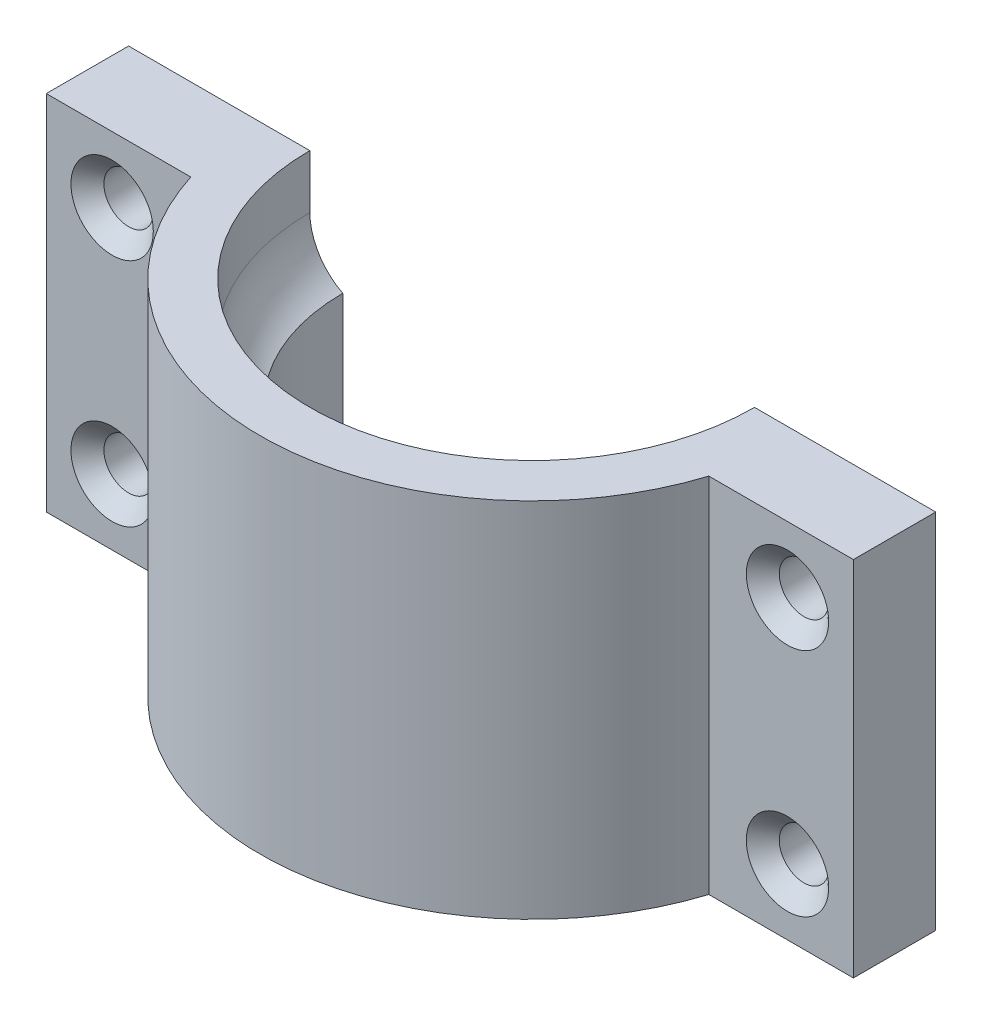
ISO-10303-21;
HEADER;
FILE_DESCRIPTION(('STEP AP214'),'2;1');
FILE_NAME('part.step','',(''),(''),'','','');
FILE_SCHEMA(('AUTOMOTIVE_DESIGN { 1 0 10303 214 1 1 1 1 }'));
ENDSEC;
DATA;
#1=APPLICATION_CONTEXT('core data for automotive mechanical design processes');
#2=APPLICATION_PROTOCOL_DEFINITION('international standard','automotive_design',2000,#1);
#3=PRODUCT_CONTEXT('',#1,'mechanical');
#4=PRODUCT('Part','Part','',(#3));
#5=PRODUCT_RELATED_PRODUCT_CATEGORY('part','',(#4));
#6=PRODUCT_DEFINITION_FORMATION('','',#4);
#7=PRODUCT_DEFINITION_CONTEXT('part definition',#1,'design');
#8=PRODUCT_DEFINITION('design','',#6,#7);
#9=PRODUCT_DEFINITION_SHAPE('','',#8);
#10=(LENGTH_UNIT() NAMED_UNIT(*) SI_UNIT(.MILLI.,.METRE.));
#11=(NAMED_UNIT(*) PLANE_ANGLE_UNIT() SI_UNIT($,.RADIAN.));
#12=(NAMED_UNIT(*) SI_UNIT($,.STERADIAN.) SOLID_ANGLE_UNIT());
#13=UNCERTAINTY_MEASURE_WITH_UNIT(LENGTH_MEASURE(1.E-05),#10,'distance_accuracy_value','');
#14=(GEOMETRIC_REPRESENTATION_CONTEXT(3) GLOBAL_UNCERTAINTY_ASSIGNED_CONTEXT((#13)) GLOBAL_UNIT_ASSIGNED_CONTEXT((#10,
#11,#12)) REPRESENTATION_CONTEXT('',''));
#15=CARTESIAN_POINT('',(0.,0.,0.));
#16=DIRECTION('',(0.,0.,1.));
#17=DIRECTION('',(1.,0.,0.));
#18=AXIS2_PLACEMENT_3D('',#15,#16,#17);
#19=CARTESIAN_POINT('',(0.,-22.,0.));
#20=DIRECTION('',(0.,0.,-1.));
#21=DIRECTION('',(-1.,0.,0.));
#22=AXIS2_PLACEMENT_3D('',#19,#20,#21);
#23=PLANE('',#22);
#24=CARTESIAN_POINT('',(-20.5,-18.,0.));
#25=DIRECTION('',(0.,0.,-1.));
#26=DIRECTION('',(-1.,0.,0.));
#27=AXIS2_PLACEMENT_3D('',#24,#25,#26);
#28=CIRCLE('',#27,1.5);
#29=CARTESIAN_POINT('',(-22.,-18.,0.));
#30=VERTEX_POINT('',#29);
#31=EDGE_CURVE('E165',#30,#30,#28,.T.);
#32=ORIENTED_EDGE('',*,*,#31,.F.);
#33=EDGE_LOOP('',(#32));
#34=FACE_BOUND('',#33,.T.);
#35=CARTESIAN_POINT('',(-20.5,-4.,0.));
#36=DIRECTION('',(0.,0.,-1.));
#37=DIRECTION('',(-1.,0.,0.));
#38=AXIS2_PLACEMENT_3D('',#35,#36,#37);
#39=CIRCLE('',#38,1.5);
#40=CARTESIAN_POINT('',(-22.,-4.,0.));
#41=VERTEX_POINT('',#40);
#42=EDGE_CURVE('E206',#41,#41,#39,.T.);
#43=ORIENTED_EDGE('',*,*,#42,.F.);
#44=EDGE_LOOP('',(#43));
#45=FACE_BOUND('',#44,.T.);
#46=DIRECTION('',(0.,1.,0.));
#47=VECTOR('',#46,1.);
#48=CARTESIAN_POINT('',(-13.5,2.83425520472351,0.));
#49=LINE('',#48,#47);
#50=CARTESIAN_POINT('',(-13.5,0.,0.));
#51=VERTEX_POINT('',#50);
#52=CARTESIAN_POINT('',(-13.5,-3.26371538085914,0.));
#53=VERTEX_POINT('',#52);
#54=EDGE_CURVE('E65',#51,#53,#49,.F.);
#55=ORIENTED_EDGE('',*,*,#54,.T.);
#56=CARTESIAN_POINT('',(-9.8003409289421,-3.21348831704943,0.));
#57=DIRECTION('',(0.,0.,-1.));
#58=DIRECTION('',(-1.,0.,0.));
#59=AXIS2_PLACEMENT_3D('',#56,#57,#58);
#60=CIRCLE('',#59,3.7);
#61=CARTESIAN_POINT('',(-11.5,-6.5,0.));
#62=VERTEX_POINT('',#61);
#63=EDGE_CURVE('E254',#53,#62,#60,.F.);
#64=ORIENTED_EDGE('',*,*,#63,.T.);
#65=DIRECTION('',(0.,1.,0.));
#66=VECTOR('',#65,1.);
#67=CARTESIAN_POINT('',(-11.5,-22.,0.));
#68=LINE('',#67,#66);
#69=CARTESIAN_POINT('',(-11.5,-22.,0.));
#70=VERTEX_POINT('',#69);
#71=EDGE_CURVE('E138',#70,#62,#68,.T.);
#72=ORIENTED_EDGE('',*,*,#71,.F.);
#73=DIRECTION('',(-1.,0.,0.));
#74=VECTOR('',#73,1.);
#75=CARTESIAN_POINT('',(0.,-22.,0.));
#76=LINE('',#75,#74);
#77=CARTESIAN_POINT('',(-24.5,-22.,0.));
#78=VERTEX_POINT('',#77);
#79=EDGE_CURVE('E142',#70,#78,#76,.T.);
#80=ORIENTED_EDGE('',*,*,#79,.T.);
#81=DIRECTION('',(0.,1.,0.));
#82=VECTOR('',#81,1.);
#83=CARTESIAN_POINT('',(-24.5,-22.,0.));
#84=LINE('',#83,#82);
#85=CARTESIAN_POINT('',(-24.5,0.,0.));
#86=VERTEX_POINT('',#85);
#87=EDGE_CURVE('E126',#78,#86,#84,.T.);
#88=ORIENTED_EDGE('',*,*,#87,.T.);
#89=DIRECTION('',(-1.,0.,0.));
#90=VECTOR('',#89,1.);
#91=CARTESIAN_POINT('',(0.,0.,0.));
#92=LINE('',#91,#90);
#93=EDGE_CURVE('E175',#51,#86,#92,.T.);
#94=ORIENTED_EDGE('',*,*,#93,.F.);
#95=EDGE_LOOP('',(#55,#64,#72,#80,#88,#94));
#96=FACE_BOUND('',#95,.T.);
#97=ADVANCED_FACE('F48',(#34,#45,#96),#23,.T.);
#98=CARTESIAN_POINT('',(0.,-22.,0.));
#99=DIRECTION('',(0.,1.,0.));
#100=DIRECTION('',(0.,0.,1.));
#101=AXIS2_PLACEMENT_3D('',#98,#99,#100);
#102=CYLINDRICAL_SURFACE('',#101,11.5);
#103=CARTESIAN_POINT('',(0.,-6.5,0.));
#104=DIRECTION('',(0.,1.,0.));
#105=DIRECTION('',(0.,0.,1.));
#106=AXIS2_PLACEMENT_3D('',#103,#104,#105);
#107=CIRCLE('',#106,11.5);
#108=CARTESIAN_POINT('',(11.5,-6.5,0.));
#109=VERTEX_POINT('',#108);
#110=EDGE_CURVE('E265',#62,#109,#107,.T.);
#111=ORIENTED_EDGE('',*,*,#110,.T.);
#112=DIRECTION('',(0.,1.,0.));
#113=VECTOR('',#112,1.);
#114=CARTESIAN_POINT('',(11.5,-22.,0.));
#115=LINE('',#114,#113);
#116=CARTESIAN_POINT('',(11.5,-22.,0.));
#117=VERTEX_POINT('',#116);
#118=EDGE_CURVE('E192',#117,#109,#115,.T.);
#119=ORIENTED_EDGE('',*,*,#118,.F.);
#120=CARTESIAN_POINT('',(0.,-22.,0.));
#121=DIRECTION('',(0.,1.,0.));
#122=DIRECTION('',(0.,0.,1.));
#123=AXIS2_PLACEMENT_3D('',#120,#121,#122);
#124=CIRCLE('',#123,11.5);
#125=EDGE_CURVE('E150',#70,#117,#124,.T.);
#126=ORIENTED_EDGE('',*,*,#125,.F.);
#127=ORIENTED_EDGE('',*,*,#71,.T.);
#128=EDGE_LOOP('',(#111,#119,#126,#127));
#129=FACE_BOUND('',#128,.T.);
#130=ADVANCED_FACE('F309',(#129),#102,.F.);
#131=CARTESIAN_POINT('',(0.,-22.,0.));
#132=DIRECTION('',(0.,0.,1.));
#133=DIRECTION('',(1.,0.,0.));
#134=AXIS2_PLACEMENT_3D('',#131,#132,#133);
#135=PLANE('',#134);
#136=CARTESIAN_POINT('',(20.5,-18.,0.));
#137=DIRECTION('',(0.,0.,1.));
#138=DIRECTION('',(1.,0.,0.));
#139=AXIS2_PLACEMENT_3D('',#136,#137,#138);
#140=CIRCLE('',#139,1.5);
#141=CARTESIAN_POINT('',(22.,-18.,0.));
#142=VERTEX_POINT('',#141);
#143=EDGE_CURVE('E263',#142,#142,#140,.T.);
#144=ORIENTED_EDGE('',*,*,#143,.T.);
#145=EDGE_LOOP('',(#144));
#146=FACE_BOUND('',#145,.T.);
#147=CARTESIAN_POINT('',(20.5,-4.,0.));
#148=DIRECTION('',(0.,0.,1.));
#149=DIRECTION('',(1.,0.,0.));
#150=AXIS2_PLACEMENT_3D('',#147,#148,#149);
#151=CIRCLE('',#150,1.5);
#152=CARTESIAN_POINT('',(22.,-4.,0.));
#153=VERTEX_POINT('',#152);
#154=EDGE_CURVE('E210',#153,#153,#151,.T.);
#155=ORIENTED_EDGE('',*,*,#154,.T.);
#156=EDGE_LOOP('',(#155));
#157=FACE_BOUND('',#156,.T.);
#158=CARTESIAN_POINT('',(9.8003409289421,-3.21348831704943,0.));
#159=DIRECTION('',(0.,0.,1.));
#160=DIRECTION('',(1.,0.,0.));
#161=AXIS2_PLACEMENT_3D('',#158,#159,#160);
#162=CIRCLE('',#161,3.7);
#163=CARTESIAN_POINT('',(13.5,-3.26371538085914,0.));
#164=VERTEX_POINT('',#163);
#165=EDGE_CURVE('E11',#164,#109,#162,.F.);
#166=ORIENTED_EDGE('',*,*,#165,.F.);
#167=DIRECTION('',(0.,1.,0.));
#168=VECTOR('',#167,1.);
#169=CARTESIAN_POINT('',(13.5,2.83425520472351,0.));
#170=LINE('',#169,#168);
#171=CARTESIAN_POINT('',(13.5,0.,0.));
#172=VERTEX_POINT('',#171);
#173=EDGE_CURVE('E259',#172,#164,#170,.F.);
#174=ORIENTED_EDGE('',*,*,#173,.F.);
#175=DIRECTION('',(1.,0.,0.));
#176=VECTOR('',#175,1.);
#177=CARTESIAN_POINT('',(0.,0.,0.));
#178=LINE('',#177,#176);
#179=CARTESIAN_POINT('',(24.5,0.,0.));
#180=VERTEX_POINT('',#179);
#181=EDGE_CURVE('E172',#172,#180,#178,.T.);
#182=ORIENTED_EDGE('',*,*,#181,.T.);
#183=DIRECTION('',(0.,1.,0.));
#184=VECTOR('',#183,1.);
#185=CARTESIAN_POINT('',(24.5,-22.,0.));
#186=LINE('',#185,#184);
#187=CARTESIAN_POINT('',(24.5,-22.,0.));
#188=VERTEX_POINT('',#187);
#189=EDGE_CURVE('E196',#188,#180,#186,.T.);
#190=ORIENTED_EDGE('',*,*,#189,.F.);
#191=DIRECTION('',(1.,0.,0.));
#192=VECTOR('',#191,1.);
#193=CARTESIAN_POINT('',(0.,-22.,0.));
#194=LINE('',#193,#192);
#195=EDGE_CURVE('E153',#117,#188,#194,.T.);
#196=ORIENTED_EDGE('',*,*,#195,.F.);
#197=ORIENTED_EDGE('',*,*,#118,.T.);
#198=EDGE_LOOP('',(#166,#174,#182,#190,#196,#197));
#199=FACE_BOUND('',#198,.T.);
#200=ADVANCED_FACE('F289',(#146,#157,#199),#135,.F.);
#201=CARTESIAN_POINT('',(0.,-22.,0.));
#202=DIRECTION('',(0.,1.,0.));
#203=DIRECTION('',(0.,0.,1.));
#204=AXIS2_PLACEMENT_3D('',#201,#202,#203);
#205=CYLINDRICAL_SURFACE('',#204,16.5);
#206=CARTESIAN_POINT('',(0.,0.,0.));
#207=DIRECTION('',(0.,1.,0.));
#208=DIRECTION('',(0.,0.,1.));
#209=AXIS2_PLACEMENT_3D('',#206,#207,#208);
#210=CIRCLE('',#209,16.5);
#211=CARTESIAN_POINT('',(-15.7241851935164,0.,5.));
#212=VERTEX_POINT('',#211);
#213=CARTESIAN_POINT('',(15.7241851935164,0.,5.));
#214=VERTEX_POINT('',#213);
#215=EDGE_CURVE('E160',#212,#214,#210,.T.);
#216=ORIENTED_EDGE('',*,*,#215,.F.);
#217=DIRECTION('',(0.,1.,0.));
#218=VECTOR('',#217,1.);
#219=CARTESIAN_POINT('',(-15.7241851935164,-22.,5.));
#220=LINE('',#219,#218);
#221=CARTESIAN_POINT('',(-15.7241851935164,-22.,5.));
#222=VERTEX_POINT('',#221);
#223=EDGE_CURVE('E74',#222,#212,#220,.T.);
#224=ORIENTED_EDGE('',*,*,#223,.F.);
#225=CARTESIAN_POINT('',(0.,-22.,0.));
#226=DIRECTION('',(0.,1.,0.));
#227=DIRECTION('',(0.,0.,1.));
#228=AXIS2_PLACEMENT_3D('',#225,#226,#227);
#229=CIRCLE('',#228,16.5);
#230=CARTESIAN_POINT('',(15.7241851935164,-22.,5.));
#231=VERTEX_POINT('',#230);
#232=EDGE_CURVE('E184',#222,#231,#229,.T.);
#233=ORIENTED_EDGE('',*,*,#232,.T.);
#234=DIRECTION('',(0.,1.,0.));
#235=VECTOR('',#234,1.);
#236=CARTESIAN_POINT('',(15.7241851935164,-22.,5.));
#237=LINE('',#236,#235);
#238=EDGE_CURVE('E159',#231,#214,#237,.T.);
#239=ORIENTED_EDGE('',*,*,#238,.T.);
#240=EDGE_LOOP('',(#216,#224,#233,#239));
#241=FACE_BOUND('',#240,.T.);
#242=ADVANCED_FACE('F295',(#241),#205,.T.);
#243=CARTESIAN_POINT('',(0.,-22.,5.));
#244=DIRECTION('',(0.,0.,1.));
#245=DIRECTION('',(1.,0.,0.));
#246=AXIS2_PLACEMENT_3D('',#243,#244,#245);
#247=PLANE('',#246);
#248=CARTESIAN_POINT('',(-20.5,-4.,5.));
#249=DIRECTION('',(0.,0.,1.));
#250=DIRECTION('',(1.,0.,0.));
#251=AXIS2_PLACEMENT_3D('',#248,#249,#250);
#252=CIRCLE('',#251,2.5);
#253=CARTESIAN_POINT('',(-18.,-4.,5.));
#254=VERTEX_POINT('',#253);
#255=EDGE_CURVE('E237',#254,#254,#252,.F.);
#256=ORIENTED_EDGE('',*,*,#255,.T.);
#257=EDGE_LOOP('',(#256));
#258=FACE_BOUND('',#257,.T.);
#259=CARTESIAN_POINT('',(-20.5,-18.,5.));
#260=DIRECTION('',(0.,0.,1.));
#261=DIRECTION('',(1.,0.,0.));
#262=AXIS2_PLACEMENT_3D('',#259,#260,#261);
#263=CIRCLE('',#262,2.50000000000002);
#264=CARTESIAN_POINT('',(-18.,-18.,5.));
#265=VERTEX_POINT('',#264);
#266=EDGE_CURVE('E233',#265,#265,#263,.F.);
#267=ORIENTED_EDGE('',*,*,#266,.T.);
#268=EDGE_LOOP('',(#267));
#269=FACE_BOUND('',#268,.T.);
#270=DIRECTION('',(1.,0.,0.));
#271=VECTOR('',#270,1.);
#272=CARTESIAN_POINT('',(0.,0.,5.));
#273=LINE('',#272,#271);
#274=CARTESIAN_POINT('',(-24.5,0.,5.));
#275=VERTEX_POINT('',#274);
#276=EDGE_CURVE('E180',#275,#212,#273,.T.);
#277=ORIENTED_EDGE('',*,*,#276,.F.);
#278=DIRECTION('',(0.,1.,0.));
#279=VECTOR('',#278,1.);
#280=CARTESIAN_POINT('',(-24.5,-22.,5.));
#281=LINE('',#280,#279);
#282=CARTESIAN_POINT('',(-24.5,-22.,5.));
#283=VERTEX_POINT('',#282);
#284=EDGE_CURVE('E137',#283,#275,#281,.T.);
#285=ORIENTED_EDGE('',*,*,#284,.F.);
#286=DIRECTION('',(1.,0.,0.));
#287=VECTOR('',#286,1.);
#288=CARTESIAN_POINT('',(0.,-22.,5.));
#289=LINE('',#288,#287);
#290=EDGE_CURVE('E143',#283,#222,#289,.T.);
#291=ORIENTED_EDGE('',*,*,#290,.T.);
#292=ORIENTED_EDGE('',*,*,#223,.T.);
#293=EDGE_LOOP('',(#277,#285,#291,#292));
#294=FACE_BOUND('',#293,.T.);
#295=ADVANCED_FACE('F296',(#258,#269,#294),#247,.T.);
#296=CARTESIAN_POINT('',(-24.5,-22.,0.));
#297=DIRECTION('',(-1.,0.,0.));
#298=DIRECTION('',(0.,0.,1.));
#299=AXIS2_PLACEMENT_3D('',#296,#297,#298);
#300=PLANE('',#299);
#301=DIRECTION('',(0.,0.,1.));
#302=VECTOR('',#301,1.);
#303=CARTESIAN_POINT('',(-24.5,0.,0.));
#304=LINE('',#303,#302);
#305=EDGE_CURVE('E132',#86,#275,#304,.T.);
#306=ORIENTED_EDGE('',*,*,#305,.F.);
#307=ORIENTED_EDGE('',*,*,#87,.F.);
#308=DIRECTION('',(0.,0.,1.));
#309=VECTOR('',#308,1.);
#310=CARTESIAN_POINT('',(-24.5,-22.,0.));
#311=LINE('',#310,#309);
#312=EDGE_CURVE('E129',#78,#283,#311,.T.);
#313=ORIENTED_EDGE('',*,*,#312,.T.);
#314=ORIENTED_EDGE('',*,*,#284,.T.);
#315=EDGE_LOOP('',(#306,#307,#313,#314));
#316=FACE_BOUND('',#315,.T.);
#317=ADVANCED_FACE('F128',(#316),#300,.T.);
#318=CARTESIAN_POINT('',(24.5,-22.,0.));
#319=DIRECTION('',(-1.,0.,0.));
#320=DIRECTION('',(0.,0.,1.));
#321=AXIS2_PLACEMENT_3D('',#318,#319,#320);
#322=PLANE('',#321);
#323=DIRECTION('',(0.,0.,1.));
#324=VECTOR('',#323,1.);
#325=CARTESIAN_POINT('',(24.5,0.,0.));
#326=LINE('',#325,#324);
#327=CARTESIAN_POINT('',(24.5,0.,5.));
#328=VERTEX_POINT('',#327);
#329=EDGE_CURVE('E169',#180,#328,#326,.T.);
#330=ORIENTED_EDGE('',*,*,#329,.T.);
#331=DIRECTION('',(0.,1.,0.));
#332=VECTOR('',#331,1.);
#333=CARTESIAN_POINT('',(24.5,-22.,5.));
#334=LINE('',#333,#332);
#335=CARTESIAN_POINT('',(24.5,-22.,5.));
#336=VERTEX_POINT('',#335);
#337=EDGE_CURVE('E200',#336,#328,#334,.T.);
#338=ORIENTED_EDGE('',*,*,#337,.F.);
#339=DIRECTION('',(0.,0.,1.));
#340=VECTOR('',#339,1.);
#341=CARTESIAN_POINT('',(24.5,-22.,0.));
#342=LINE('',#341,#340);
#343=EDGE_CURVE('E279',#188,#336,#342,.T.);
#344=ORIENTED_EDGE('',*,*,#343,.F.);
#345=ORIENTED_EDGE('',*,*,#189,.T.);
#346=EDGE_LOOP('',(#330,#338,#344,#345));
#347=FACE_BOUND('',#346,.T.);
#348=ADVANCED_FACE('F291',(#347),#322,.F.);
#349=CARTESIAN_POINT('',(0.,-22.,5.));
#350=DIRECTION('',(0.,0.,-1.));
#351=DIRECTION('',(-1.,0.,0.));
#352=AXIS2_PLACEMENT_3D('',#349,#350,#351);
#353=PLANE('',#352);
#354=CARTESIAN_POINT('',(20.5,-4.,5.));
#355=DIRECTION('',(0.,0.,-1.));
#356=DIRECTION('',(-1.,0.,0.));
#357=AXIS2_PLACEMENT_3D('',#354,#355,#356);
#358=CIRCLE('',#357,2.5);
#359=CARTESIAN_POINT('',(18.,-4.,5.));
#360=VERTEX_POINT('',#359);
#361=EDGE_CURVE('E221',#360,#360,#358,.T.);
#362=ORIENTED_EDGE('',*,*,#361,.T.);
#363=EDGE_LOOP('',(#362));
#364=FACE_BOUND('',#363,.T.);
#365=CARTESIAN_POINT('',(20.5,-18.,5.));
#366=DIRECTION('',(0.,0.,-1.));
#367=DIRECTION('',(-1.,0.,0.));
#368=AXIS2_PLACEMENT_3D('',#365,#366,#367);
#369=CIRCLE('',#368,2.50000000000002);
#370=CARTESIAN_POINT('',(18.,-18.,5.));
#371=VERTEX_POINT('',#370);
#372=EDGE_CURVE('E217',#371,#371,#369,.T.);
#373=ORIENTED_EDGE('',*,*,#372,.T.);
#374=EDGE_LOOP('',(#373));
#375=FACE_BOUND('',#374,.T.);
#376=DIRECTION('',(-1.,0.,0.));
#377=VECTOR('',#376,1.);
#378=CARTESIAN_POINT('',(0.,0.,5.));
#379=LINE('',#378,#377);
#380=EDGE_CURVE('E164',#328,#214,#379,.T.);
#381=ORIENTED_EDGE('',*,*,#380,.T.);
#382=ORIENTED_EDGE('',*,*,#238,.F.);
#383=DIRECTION('',(-1.,0.,0.));
#384=VECTOR('',#383,1.);
#385=CARTESIAN_POINT('',(0.,-22.,5.));
#386=LINE('',#385,#384);
#387=EDGE_CURVE('E107',#336,#231,#386,.T.);
#388=ORIENTED_EDGE('',*,*,#387,.F.);
#389=ORIENTED_EDGE('',*,*,#337,.T.);
#390=EDGE_LOOP('',(#381,#382,#388,#389));
#391=FACE_BOUND('',#390,.T.);
#392=ADVANCED_FACE('F294',(#364,#375,#391),#353,.F.);
#393=CARTESIAN_POINT('',(0.,-22.,0.));
#394=DIRECTION('',(0.,1.,0.));
#395=DIRECTION('',(0.,0.,1.));
#396=AXIS2_PLACEMENT_3D('',#393,#394,#395);
#397=PLANE('',#396);
#398=ORIENTED_EDGE('',*,*,#232,.F.);
#399=ORIENTED_EDGE('',*,*,#290,.F.);
#400=ORIENTED_EDGE('',*,*,#312,.F.);
#401=ORIENTED_EDGE('',*,*,#79,.F.);
#402=ORIENTED_EDGE('',*,*,#125,.T.);
#403=ORIENTED_EDGE('',*,*,#195,.T.);
#404=ORIENTED_EDGE('',*,*,#343,.T.);
#405=ORIENTED_EDGE('',*,*,#387,.T.);
#406=EDGE_LOOP('',(#398,#399,#400,#401,#402,#403,#404,#405));
#407=FACE_BOUND('',#406,.T.);
#408=ADVANCED_FACE('F141',(#407),#397,.F.);
#409=CARTESIAN_POINT('',(0.,0.,0.));
#410=DIRECTION('',(0.,1.,0.));
#411=DIRECTION('',(0.,0.,1.));
#412=AXIS2_PLACEMENT_3D('',#409,#410,#411);
#413=PLANE('',#412);
#414=ORIENTED_EDGE('',*,*,#181,.F.);
#415=CARTESIAN_POINT('',(0.,0.,0.));
#416=DIRECTION('',(0.,1.,0.));
#417=DIRECTION('',(0.,0.,1.));
#418=AXIS2_PLACEMENT_3D('',#415,#416,#417);
#419=CIRCLE('',#418,13.5);
#420=EDGE_CURVE('E58',#172,#51,#419,.F.);
#421=ORIENTED_EDGE('',*,*,#420,.T.);
#422=ORIENTED_EDGE('',*,*,#93,.T.);
#423=ORIENTED_EDGE('',*,*,#305,.T.);
#424=ORIENTED_EDGE('',*,*,#276,.T.);
#425=ORIENTED_EDGE('',*,*,#215,.T.);
#426=ORIENTED_EDGE('',*,*,#380,.F.);
#427=ORIENTED_EDGE('',*,*,#329,.F.);
#428=EDGE_LOOP('',(#414,#421,#422,#423,#424,#425,#426,#427));
#429=FACE_BOUND('',#428,.T.);
#430=ADVANCED_FACE('F247',(#429),#413,.T.);
#431=CARTESIAN_POINT('',(20.5,-18.,-6.6746653814699));
#432=DIRECTION('',(0.,0.,1.));
#433=DIRECTION('',(1.,0.,0.));
#434=AXIS2_PLACEMENT_3D('',#431,#432,#433);
#435=CYLINDRICAL_SURFACE('',#434,1.5);
#436=CARTESIAN_POINT('',(20.5,-18.,3.99999999999999));
#437=DIRECTION('',(0.,0.,-1.));
#438=DIRECTION('',(-1.,0.,0.));
#439=AXIS2_PLACEMENT_3D('',#436,#437,#438);
#440=CIRCLE('',#439,1.5);
#441=CARTESIAN_POINT('',(19.,-18.,3.99999999999999));
#442=VERTEX_POINT('',#441);
#443=EDGE_CURVE('E225',#442,#442,#440,.F.);
#444=ORIENTED_EDGE('',*,*,#443,.T.);
#445=EDGE_LOOP('',(#444));
#446=FACE_BOUND('',#445,.T.);
#447=ORIENTED_EDGE('',*,*,#143,.F.);
#448=EDGE_LOOP('',(#447));
#449=FACE_BOUND('',#448,.T.);
#450=ADVANCED_FACE('F369',(#446,#449),#435,.F.);
#451=CARTESIAN_POINT('',(20.5,-4.,-6.6746653814699));
#452=DIRECTION('',(0.,0.,1.));
#453=DIRECTION('',(1.,0.,0.));
#454=AXIS2_PLACEMENT_3D('',#451,#452,#453);
#455=CYLINDRICAL_SURFACE('',#454,1.5);
#456=CARTESIAN_POINT('',(20.5,-4.,4.00000000000001));
#457=DIRECTION('',(0.,0.,-1.));
#458=DIRECTION('',(-1.,0.,0.));
#459=AXIS2_PLACEMENT_3D('',#456,#457,#458);
#460=CIRCLE('',#459,1.5);
#461=CARTESIAN_POINT('',(19.,-4.,4.00000000000001));
#462=VERTEX_POINT('',#461);
#463=EDGE_CURVE('E187',#462,#462,#460,.F.);
#464=ORIENTED_EDGE('',*,*,#463,.T.);
#465=EDGE_LOOP('',(#464));
#466=FACE_BOUND('',#465,.T.);
#467=ORIENTED_EDGE('',*,*,#154,.F.);
#468=EDGE_LOOP('',(#467));
#469=FACE_BOUND('',#468,.T.);
#470=ADVANCED_FACE('F360',(#466,#469),#455,.F.);
#471=CARTESIAN_POINT('',(-20.5,-4.,-6.6746653814699));
#472=DIRECTION('',(0.,0.,1.));
#473=DIRECTION('',(1.,0.,0.));
#474=AXIS2_PLACEMENT_3D('',#471,#472,#473);
#475=CYLINDRICAL_SURFACE('',#474,1.5);
#476=CARTESIAN_POINT('',(-20.5,-4.,4.00000000000001));
#477=DIRECTION('',(0.,0.,1.));
#478=DIRECTION('',(1.,0.,0.));
#479=AXIS2_PLACEMENT_3D('',#476,#477,#478);
#480=CIRCLE('',#479,1.5);
#481=CARTESIAN_POINT('',(-19.,-4.,4.00000000000001));
#482=VERTEX_POINT('',#481);
#483=EDGE_CURVE('E229',#482,#482,#480,.T.);
#484=ORIENTED_EDGE('',*,*,#483,.T.);
#485=EDGE_LOOP('',(#484));
#486=FACE_BOUND('',#485,.T.);
#487=ORIENTED_EDGE('',*,*,#42,.T.);
#488=EDGE_LOOP('',(#487));
#489=FACE_BOUND('',#488,.T.);
#490=ADVANCED_FACE('F357',(#486,#489),#475,.F.);
#491=CARTESIAN_POINT('',(-20.5,-18.,-6.6746653814699));
#492=DIRECTION('',(0.,0.,1.));
#493=DIRECTION('',(1.,0.,0.));
#494=AXIS2_PLACEMENT_3D('',#491,#492,#493);
#495=CYLINDRICAL_SURFACE('',#494,1.5);
#496=CARTESIAN_POINT('',(-20.5,-18.,3.99999999999999));
#497=DIRECTION('',(0.,0.,1.));
#498=DIRECTION('',(1.,0.,0.));
#499=AXIS2_PLACEMENT_3D('',#496,#497,#498);
#500=CIRCLE('',#499,1.5);
#501=CARTESIAN_POINT('',(-19.,-18.,3.99999999999999));
#502=VERTEX_POINT('',#501);
#503=EDGE_CURVE('E241',#502,#502,#500,.T.);
#504=ORIENTED_EDGE('',*,*,#503,.T.);
#505=EDGE_LOOP('',(#504));
#506=FACE_BOUND('',#505,.T.);
#507=ORIENTED_EDGE('',*,*,#31,.T.);
#508=EDGE_LOOP('',(#507));
#509=FACE_BOUND('',#508,.T.);
#510=ADVANCED_FACE('F336',(#506,#509),#495,.F.);
#511=CARTESIAN_POINT('',(20.5,-4.,4.00000000000001));
#512=DIRECTION('',(0.,0.,1.));
#513=DIRECTION('',(1.,0.,0.));
#514=AXIS2_PLACEMENT_3D('',#511,#512,#513);
#515=CONICAL_SURFACE('',#514,1.5,0.785398163397449);
#516=ORIENTED_EDGE('',*,*,#361,.F.);
#517=EDGE_LOOP('',(#516));
#518=FACE_BOUND('',#517,.T.);
#519=ORIENTED_EDGE('',*,*,#463,.F.);
#520=EDGE_LOOP('',(#519));
#521=FACE_BOUND('',#520,.T.);
#522=ADVANCED_FACE('F329',(#518,#521),#515,.F.);
#523=CARTESIAN_POINT('',(20.5,-18.,3.99999999999999));
#524=DIRECTION('',(0.,0.,1.));
#525=DIRECTION('',(1.,0.,0.));
#526=AXIS2_PLACEMENT_3D('',#523,#524,#525);
#527=CONICAL_SURFACE('',#526,1.5,0.785398163397449);
#528=ORIENTED_EDGE('',*,*,#372,.F.);
#529=EDGE_LOOP('',(#528));
#530=FACE_BOUND('',#529,.T.);
#531=ORIENTED_EDGE('',*,*,#443,.F.);
#532=EDGE_LOOP('',(#531));
#533=FACE_BOUND('',#532,.T.);
#534=ADVANCED_FACE('F335',(#530,#533),#527,.F.);
#535=CARTESIAN_POINT('',(-20.5,-4.,4.00000000000001));
#536=DIRECTION('',(0.,0.,1.));
#537=DIRECTION('',(1.,0.,0.));
#538=AXIS2_PLACEMENT_3D('',#535,#536,#537);
#539=CONICAL_SURFACE('',#538,1.5,0.785398163397449);
#540=ORIENTED_EDGE('',*,*,#255,.F.);
#541=EDGE_LOOP('',(#540));
#542=FACE_BOUND('',#541,.T.);
#543=ORIENTED_EDGE('',*,*,#483,.F.);
#544=EDGE_LOOP('',(#543));
#545=FACE_BOUND('',#544,.T.);
#546=ADVANCED_FACE('F342',(#542,#545),#539,.F.);
#547=CARTESIAN_POINT('',(-20.5,-18.,3.99999999999999));
#548=DIRECTION('',(0.,0.,1.));
#549=DIRECTION('',(1.,0.,0.));
#550=AXIS2_PLACEMENT_3D('',#547,#548,#549);
#551=CONICAL_SURFACE('',#550,1.5,0.785398163397449);
#552=ORIENTED_EDGE('',*,*,#266,.F.);
#553=EDGE_LOOP('',(#552));
#554=FACE_BOUND('',#553,.T.);
#555=ORIENTED_EDGE('',*,*,#503,.F.);
#556=EDGE_LOOP('',(#555));
#557=FACE_BOUND('',#556,.T.);
#558=ADVANCED_FACE('F51',(#554,#557),#551,.F.);
#559=CARTESIAN_POINT('',(0.,-3.21348831704943,0.));
#560=DIRECTION('',(0.,1.,0.));
#561=DIRECTION('',(0.,0.,1.));
#562=AXIS2_PLACEMENT_3D('',#559,#560,#561);
#563=TOROIDAL_SURFACE('',#562,9.8003409289421,3.7);
#564=CARTESIAN_POINT('',(0.,-3.26371538085914,0.));
#565=DIRECTION('',(0.,1.,0.));
#566=DIRECTION('',(0.,0.,1.));
#567=AXIS2_PLACEMENT_3D('',#564,#565,#566);
#568=CIRCLE('',#567,13.5);
#569=EDGE_CURVE('E550',#53,#164,#568,.T.);
#570=ORIENTED_EDGE('',*,*,#569,.T.);
#571=ORIENTED_EDGE('',*,*,#165,.T.);
#572=ORIENTED_EDGE('',*,*,#110,.F.);
#573=ORIENTED_EDGE('',*,*,#63,.F.);
#574=EDGE_LOOP('',(#570,#571,#572,#573));
#575=FACE_BOUND('',#574,.T.);
#576=ADVANCED_FACE('F351',(#575),#563,.F.);
#577=CARTESIAN_POINT('',(0.,2.83425520472351,0.));
#578=DIRECTION('',(0.,1.,0.));
#579=DIRECTION('',(0.,0.,1.));
#580=AXIS2_PLACEMENT_3D('',#577,#578,#579);
#581=CYLINDRICAL_SURFACE('',#580,13.5);
#582=ORIENTED_EDGE('',*,*,#420,.F.);
#583=ORIENTED_EDGE('',*,*,#173,.T.);
#584=ORIENTED_EDGE('',*,*,#569,.F.);
#585=ORIENTED_EDGE('',*,*,#54,.F.);
#586=EDGE_LOOP('',(#582,#583,#584,#585));
#587=FACE_BOUND('',#586,.T.);
#588=ADVANCED_FACE('F386',(#587),#581,.F.);
#589=CLOSED_SHELL('',(#97,#130,#200,#242,#295,#317,#348,#392,#408,#430,#450,#470,#490,#510,#522,
#534,#546,#558,#576,#588));
#590=MANIFOLD_SOLID_BREP('B2',#589);
#591=ADVANCED_BREP_SHAPE_REPRESENTATION('',(#18,#590),#14);
#592=SHAPE_DEFINITION_REPRESENTATION(#9,#591);
ENDSEC;
END-ISO-10303-21;
